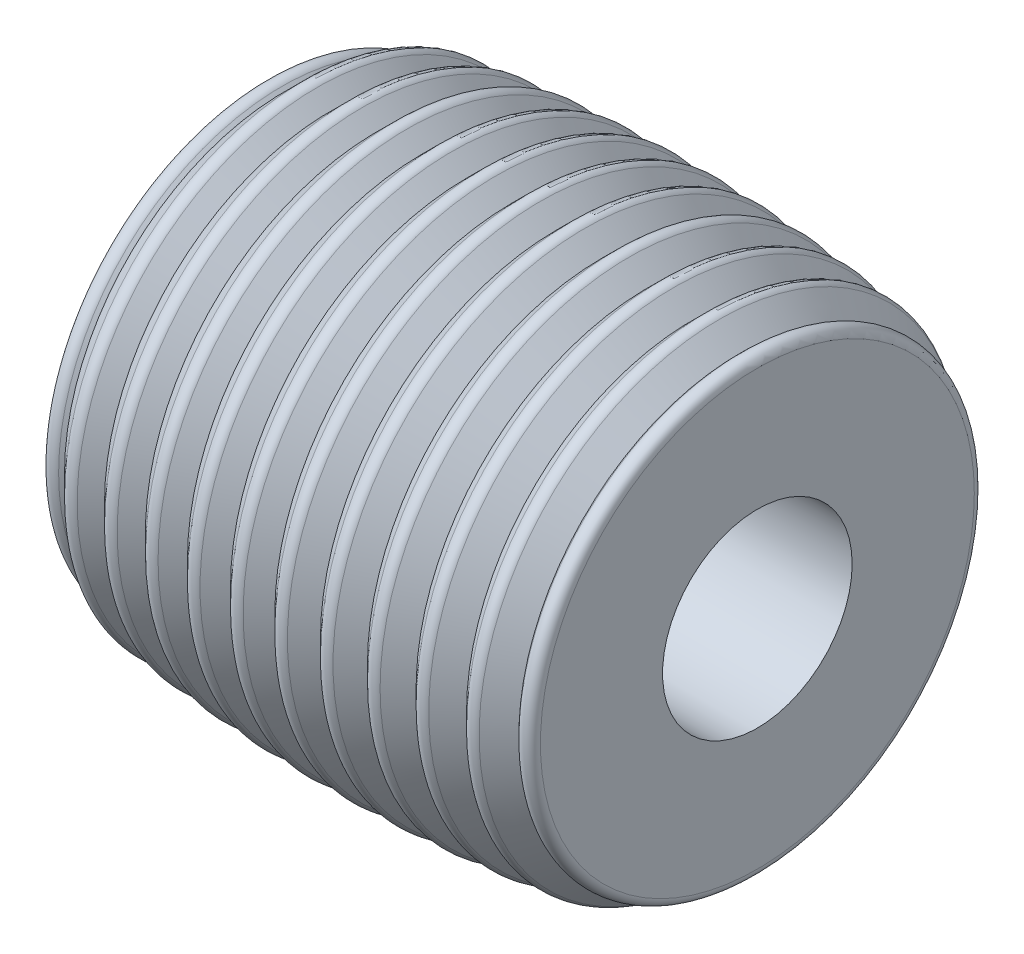
ISO-10303-21;
HEADER;
FILE_DESCRIPTION(('STEP AP214'),'2;1');
FILE_NAME('part.step','',(''),(''),'','','');
FILE_SCHEMA(('AUTOMOTIVE_DESIGN { 1 0 10303 214 1 1 1 1 }'));
ENDSEC;
DATA;
#1=APPLICATION_CONTEXT('core data for automotive mechanical design processes');
#2=APPLICATION_PROTOCOL_DEFINITION('international standard','automotive_design',2000,#1);
#3=PRODUCT_CONTEXT('',#1,'mechanical');
#4=PRODUCT('Part','Part','',(#3));
#5=PRODUCT_RELATED_PRODUCT_CATEGORY('part','',(#4));
#6=PRODUCT_DEFINITION_FORMATION('','',#4);
#7=PRODUCT_DEFINITION_CONTEXT('part definition',#1,'design');
#8=PRODUCT_DEFINITION('design','',#6,#7);
#9=PRODUCT_DEFINITION_SHAPE('','',#8);
#10=(LENGTH_UNIT() NAMED_UNIT(*) SI_UNIT(.MILLI.,.METRE.));
#11=(NAMED_UNIT(*) PLANE_ANGLE_UNIT() SI_UNIT($,.RADIAN.));
#12=(NAMED_UNIT(*) SI_UNIT($,.STERADIAN.) SOLID_ANGLE_UNIT());
#13=UNCERTAINTY_MEASURE_WITH_UNIT(LENGTH_MEASURE(1.E-05),#10,'distance_accuracy_value','');
#14=(GEOMETRIC_REPRESENTATION_CONTEXT(3) GLOBAL_UNCERTAINTY_ASSIGNED_CONTEXT((#13)) GLOBAL_UNIT_ASSIGNED_CONTEXT((#10,
#11,#12)) REPRESENTATION_CONTEXT('',''));
#15=CARTESIAN_POINT('',(0.,0.,0.));
#16=DIRECTION('',(0.,0.,1.));
#17=DIRECTION('',(1.,0.,0.));
#18=AXIS2_PLACEMENT_3D('',#15,#16,#17);
#19=CARTESIAN_POINT('',(-5.5,0.,0.));
#20=DIRECTION('',(1.,0.,0.));
#21=DIRECTION('',(0.,0.,-1.));
#22=AXIS2_PLACEMENT_3D('',#19,#20,#21);
#23=PLANE('',#22);
#24=CARTESIAN_POINT('',(-5.5,0.,0.));
#25=DIRECTION('',(1.,0.,0.));
#26=DIRECTION('',(0.,0.,-1.));
#27=AXIS2_PLACEMENT_3D('',#24,#25,#26);
#28=CIRCLE('',#27,4.86326545833715);
#29=CARTESIAN_POINT('',(-5.5,0.,-4.86326545833715));
#30=VERTEX_POINT('',#29);
#31=EDGE_CURVE('E10',#30,#30,#28,.F.);
#32=ORIENTED_EDGE('',*,*,#31,.T.);
#33=EDGE_LOOP('',(#32));
#34=FACE_BOUND('',#33,.T.);
#35=CARTESIAN_POINT('',(-5.5,0.,0.));
#36=DIRECTION('',(1.,0.,0.));
#37=DIRECTION('',(0.,0.,-1.));
#38=AXIS2_PLACEMENT_3D('',#35,#36,#37);
#39=CIRCLE('',#38,2.125);
#40=CARTESIAN_POINT('',(-5.5,0.,-2.125));
#41=VERTEX_POINT('',#40);
#42=EDGE_CURVE('E197',#41,#41,#39,.F.);
#43=ORIENTED_EDGE('',*,*,#42,.F.);
#44=EDGE_LOOP('',(#43));
#45=FACE_BOUND('',#44,.T.);
#46=ADVANCED_FACE('F47',(#34,#45),#23,.F.);
#47=CARTESIAN_POINT('',(5.09237884980486,0.,0.));
#48=DIRECTION('',(1.,0.,0.));
#49=DIRECTION('',(0.,0.,-1.));
#50=AXIS2_PLACEMENT_3D('',#47,#48,#49);
#51=CONICAL_SURFACE('',#50,4.93848702061656,0.785398163397463);
#52=CARTESIAN_POINT('',(5.15857864376269,0.,0.));
#53=DIRECTION('',(1.,0.,0.));
#54=DIRECTION('',(0.,0.,-1.));
#55=AXIS2_PLACEMENT_3D('',#52,#53,#54);
#56=CIRCLE('',#55,5.00468681457439);
#57=CARTESIAN_POINT('',(5.15857864376269,0.,-5.00468681457439));
#58=VERTEX_POINT('',#57);
#59=EDGE_CURVE('E124',#58,#58,#56,.F.);
#60=ORIENTED_EDGE('',*,*,#59,.T.);
#61=EDGE_LOOP('',(#60));
#62=FACE_BOUND('',#61,.T.);
#63=CARTESIAN_POINT('',(5.09237884980486,0.,0.));
#64=DIRECTION('',(1.,0.,0.));
#65=DIRECTION('',(0.,0.,-1.));
#66=AXIS2_PLACEMENT_3D('',#63,#64,#65);
#67=CIRCLE('',#66,4.93848702061656);
#68=CARTESIAN_POINT('',(5.09237884980486,0.,-4.93848702061656));
#69=VERTEX_POINT('',#68);
#70=EDGE_CURVE('E155',#69,#69,#67,.T.);
#71=ORIENTED_EDGE('',*,*,#70,.T.);
#72=EDGE_LOOP('',(#71));
#73=FACE_BOUND('',#72,.T.);
#74=ADVANCED_FACE('F225',(#62,#73),#51,.T.);
#75=CARTESIAN_POINT('',(4.50544744992651,0.,0.));
#76=DIRECTION('',(-1.,0.,0.));
#77=DIRECTION('',(0.,0.,1.));
#78=AXIS2_PLACEMENT_3D('',#75,#76,#77);
#79=CONICAL_SURFACE('',#78,5.5254184204949,0.785398163397437);
#80=CARTESIAN_POINT('',(4.64686880616382,0.,0.));
#81=DIRECTION('',(1.,0.,0.));
#82=DIRECTION('',(0.,0.,-1.));
#83=AXIS2_PLACEMENT_3D('',#80,#81,#82);
#84=CIRCLE('',#83,5.38399706425759);
#85=CARTESIAN_POINT('',(4.64686880616382,0.,-5.38399706425759));
#86=VERTEX_POINT('',#85);
#87=EDGE_CURVE('E136',#86,#86,#84,.T.);
#88=ORIENTED_EDGE('',*,*,#87,.T.);
#89=EDGE_LOOP('',(#88));
#90=FACE_BOUND('',#89,.T.);
#91=ORIENTED_EDGE('',*,*,#70,.F.);
#92=EDGE_LOOP('',(#91));
#93=FACE_BOUND('',#92,.T.);
#94=ADVANCED_FACE('F228',(#90,#93),#79,.T.);
#95=CARTESIAN_POINT('',(4.05735275363574,0.,0.));
#96=DIRECTION('',(1.,0.,0.));
#97=DIRECTION('',(0.,0.,-1.));
#98=AXIS2_PLACEMENT_3D('',#95,#96,#97);
#99=CONICAL_SURFACE('',#98,5.07732372420412,0.785398163397456);
#100=CARTESIAN_POINT('',(4.36402609368921,0.,0.));
#101=DIRECTION('',(-1.,0.,0.));
#102=DIRECTION('',(0.,0.,1.));
#103=AXIS2_PLACEMENT_3D('',#100,#101,#102);
#104=CIRCLE('',#103,5.38399706425759);
#105=CARTESIAN_POINT('',(4.36402609368921,0.,5.38399706425759));
#106=VERTEX_POINT('',#105);
#107=EDGE_CURVE('E132',#106,#106,#104,.T.);
#108=ORIENTED_EDGE('',*,*,#107,.T.);
#109=EDGE_LOOP('',(#108));
#110=FACE_BOUND('',#109,.T.);
#111=CARTESIAN_POINT('',(4.05735275363574,0.,0.));
#112=DIRECTION('',(1.,0.,0.));
#113=DIRECTION('',(0.,0.,-1.));
#114=AXIS2_PLACEMENT_3D('',#111,#112,#113);
#115=CIRCLE('',#114,5.07732372420412);
#116=CARTESIAN_POINT('',(4.05735275363574,0.,-5.07732372420412));
#117=VERTEX_POINT('',#116);
#118=EDGE_CURVE('E158',#117,#117,#115,.T.);
#119=ORIENTED_EDGE('',*,*,#118,.T.);
#120=EDGE_LOOP('',(#119));
#121=FACE_BOUND('',#120,.T.);
#122=ADVANCED_FACE('F235',(#110,#121),#99,.T.);
#123=CARTESIAN_POINT('',(3.49245488863042,0.,0.));
#124=DIRECTION('',(-1.,0.,0.));
#125=DIRECTION('',(0.,0.,1.));
#126=AXIS2_PLACEMENT_3D('',#123,#124,#125);
#127=CONICAL_SURFACE('',#126,5.64222158920941,0.785398163397426);
#128=CARTESIAN_POINT('',(3.63387624486774,0.,0.));
#129=DIRECTION('',(1.,0.,0.));
#130=DIRECTION('',(0.,0.,-1.));
#131=AXIS2_PLACEMENT_3D('',#128,#129,#130);
#132=CIRCLE('',#131,5.50080023297211);
#133=CARTESIAN_POINT('',(3.63387624486774,0.,-5.50080023297211));
#134=VERTEX_POINT('',#133);
#135=EDGE_CURVE('E151',#134,#134,#132,.T.);
#136=ORIENTED_EDGE('',*,*,#135,.T.);
#137=EDGE_LOOP('',(#136));
#138=FACE_BOUND('',#137,.T.);
#139=ORIENTED_EDGE('',*,*,#118,.F.);
#140=EDGE_LOOP('',(#139));
#141=FACE_BOUND('',#140,.T.);
#142=ADVANCED_FACE('F239',(#138,#141),#127,.T.);
#143=CARTESIAN_POINT('',(3.03360135933413,0.,0.));
#144=DIRECTION('',(1.,0.,0.));
#145=DIRECTION('',(0.,0.,-1.));
#146=AXIS2_PLACEMENT_3D('',#143,#144,#145);
#147=CONICAL_SURFACE('',#146,5.1833680599131,0.785398163397468);
#148=CARTESIAN_POINT('',(3.35103353239312,0.,0.));
#149=DIRECTION('',(-1.,0.,0.));
#150=DIRECTION('',(0.,0.,1.));
#151=AXIS2_PLACEMENT_3D('',#148,#149,#150);
#152=CIRCLE('',#151,5.5008002329721);
#153=CARTESIAN_POINT('',(3.35103353239312,0.,5.5008002329721));
#154=VERTEX_POINT('',#153);
#155=EDGE_CURVE('E147',#154,#154,#152,.T.);
#156=ORIENTED_EDGE('',*,*,#155,.T.);
#157=EDGE_LOOP('',(#156));
#158=FACE_BOUND('',#157,.T.);
#159=CARTESIAN_POINT('',(3.03360135933413,0.,0.));
#160=DIRECTION('',(1.,0.,0.));
#161=DIRECTION('',(0.,0.,-1.));
#162=AXIS2_PLACEMENT_3D('',#159,#160,#161);
#163=CIRCLE('',#162,5.1833680599131);
#164=CARTESIAN_POINT('',(3.03360135933413,0.,-5.1833680599131));
#165=VERTEX_POINT('',#164);
#166=EDGE_CURVE('E162',#165,#165,#163,.T.);
#167=ORIENTED_EDGE('',*,*,#166,.T.);
#168=EDGE_LOOP('',(#167));
#169=FACE_BOUND('',#168,.T.);
#170=ADVANCED_FACE('F243',(#158,#169),#147,.T.);
#171=CARTESIAN_POINT('',(2.48842748577145,0.,0.));
#172=DIRECTION('',(-1.,0.,0.));
#173=DIRECTION('',(0.,0.,1.));
#174=AXIS2_PLACEMENT_3D('',#171,#172,#173);
#175=CONICAL_SURFACE('',#174,5.72854193347576,0.78539816339743);
#176=CARTESIAN_POINT('',(2.62984884200876,0.,0.));
#177=DIRECTION('',(1.,0.,0.));
#178=DIRECTION('',(0.,0.,-1.));
#179=AXIS2_PLACEMENT_3D('',#176,#177,#178);
#180=CIRCLE('',#179,5.58712057723845);
#181=CARTESIAN_POINT('',(2.62984884200876,0.,-5.58712057723845));
#182=VERTEX_POINT('',#181);
#183=EDGE_CURVE('E144',#182,#182,#180,.T.);
#184=ORIENTED_EDGE('',*,*,#183,.T.);
#185=EDGE_LOOP('',(#184));
#186=FACE_BOUND('',#185,.T.);
#187=ORIENTED_EDGE('',*,*,#166,.F.);
#188=EDGE_LOOP('',(#187));
#189=FACE_BOUND('',#188,.T.);
#190=ADVANCED_FACE('F247',(#186,#189),#175,.T.);
#191=CARTESIAN_POINT('',(2.01800080876521,0.,0.));
#192=DIRECTION('',(1.,0.,0.));
#193=DIRECTION('',(0.,0.,-1.));
#194=AXIS2_PLACEMENT_3D('',#191,#192,#193);
#195=CONICAL_SURFACE('',#194,5.25811525646952,0.785398163397459);
#196=CARTESIAN_POINT('',(2.34700612953414,0.,0.));
#197=DIRECTION('',(-1.,0.,0.));
#198=DIRECTION('',(0.,0.,1.));
#199=AXIS2_PLACEMENT_3D('',#196,#197,#198);
#200=CIRCLE('',#199,5.58712057723845);
#201=CARTESIAN_POINT('',(2.34700612953414,0.,5.58712057723845));
#202=VERTEX_POINT('',#201);
#203=EDGE_CURVE('E140',#202,#202,#200,.T.);
#204=ORIENTED_EDGE('',*,*,#203,.T.);
#205=EDGE_LOOP('',(#204));
#206=FACE_BOUND('',#205,.T.);
#207=CARTESIAN_POINT('',(2.01800080876521,0.,0.));
#208=DIRECTION('',(1.,0.,0.));
#209=DIRECTION('',(0.,0.,-1.));
#210=AXIS2_PLACEMENT_3D('',#207,#208,#209);
#211=CIRCLE('',#210,5.25811525646952);
#212=CARTESIAN_POINT('',(2.01800080876521,0.,-5.25811525646952));
#213=VERTEX_POINT('',#212);
#214=EDGE_CURVE('E165',#213,#213,#211,.T.);
#215=ORIENTED_EDGE('',*,*,#214,.T.);
#216=EDGE_LOOP('',(#215));
#217=FACE_BOUND('',#216,.T.);
#218=ADVANCED_FACE('F251',(#206,#217),#195,.T.);
#219=CARTESIAN_POINT('',(1.49061870621543,0.,0.));
#220=DIRECTION('',(-1.,0.,0.));
#221=DIRECTION('',(0.,0.,1.));
#222=AXIS2_PLACEMENT_3D('',#219,#220,#221);
#223=CONICAL_SURFACE('',#222,5.78549735901928,0.785398163397432);
#224=CARTESIAN_POINT('',(1.63204006245274,0.,0.));
#225=DIRECTION('',(1.,0.,0.));
#226=DIRECTION('',(0.,0.,-1.));
#227=AXIS2_PLACEMENT_3D('',#224,#225,#226);
#228=CIRCLE('',#227,5.64407600278197);
#229=CARTESIAN_POINT('',(1.63204006245274,0.,-5.64407600278197));
#230=VERTEX_POINT('',#229);
#231=EDGE_CURVE('E120',#230,#230,#228,.T.);
#232=ORIENTED_EDGE('',*,*,#231,.T.);
#233=EDGE_LOOP('',(#232));
#234=FACE_BOUND('',#233,.T.);
#235=ORIENTED_EDGE('',*,*,#214,.F.);
#236=EDGE_LOOP('',(#235));
#237=FACE_BOUND('',#236,.T.);
#238=ADVANCED_FACE('F255',(#234,#237),#223,.T.);
#239=CARTESIAN_POINT('',(1.0076963467989,0.,0.));
#240=DIRECTION('',(1.,0.,0.));
#241=DIRECTION('',(0.,0.,-1.));
#242=AXIS2_PLACEMENT_3D('',#239,#240,#241);
#243=CONICAL_SURFACE('',#242,5.30257499960273,0.785398163397463);
#244=CARTESIAN_POINT('',(1.34919734997813,0.,0.));
#245=DIRECTION('',(-1.,0.,0.));
#246=DIRECTION('',(0.,0.,1.));
#247=AXIS2_PLACEMENT_3D('',#244,#245,#246);
#248=CIRCLE('',#247,5.64407600278196);
#249=CARTESIAN_POINT('',(1.34919734997813,0.,5.64407600278196));
#250=VERTEX_POINT('',#249);
#251=EDGE_CURVE('E116',#250,#250,#248,.T.);
#252=ORIENTED_EDGE('',*,*,#251,.T.);
#253=EDGE_LOOP('',(#252));
#254=FACE_BOUND('',#253,.T.);
#255=CARTESIAN_POINT('',(1.0076963467989,0.,0.));
#256=DIRECTION('',(1.,0.,0.));
#257=DIRECTION('',(0.,0.,-1.));
#258=AXIS2_PLACEMENT_3D('',#255,#256,#257);
#259=CIRCLE('',#258,5.30257499960273);
#260=CARTESIAN_POINT('',(1.0076963467989,0.,-5.30257499960273));
#261=VERTEX_POINT('',#260);
#262=EDGE_CURVE('E169',#261,#261,#259,.T.);
#263=ORIENTED_EDGE('',*,*,#262,.T.);
#264=EDGE_LOOP('',(#263));
#265=FACE_BOUND('',#264,.T.);
#266=ADVANCED_FACE('F259',(#254,#265),#243,.T.);
#267=CARTESIAN_POINT('',(0.496470070297796,0.,0.));
#268=DIRECTION('',(-1.,0.,0.));
#269=DIRECTION('',(0.,0.,1.));
#270=AXIS2_PLACEMENT_3D('',#267,#268,#269);
#271=CONICAL_SURFACE('',#270,5.81380127610383,0.78539816339744);
#272=CARTESIAN_POINT('',(0.637891426535106,0.,0.));
#273=DIRECTION('',(1.,0.,0.));
#274=DIRECTION('',(0.,0.,-1.));
#275=AXIS2_PLACEMENT_3D('',#272,#273,#274);
#276=CIRCLE('',#275,5.67237991986653);
#277=CARTESIAN_POINT('',(0.637891426535106,0.,-5.67237991986653));
#278=VERTEX_POINT('',#277);
#279=EDGE_CURVE('E112',#278,#278,#276,.T.);
#280=ORIENTED_EDGE('',*,*,#279,.T.);
#281=EDGE_LOOP('',(#280));
#282=FACE_BOUND('',#281,.T.);
#283=ORIENTED_EDGE('',*,*,#262,.F.);
#284=EDGE_LOOP('',(#283));
#285=FACE_BOUND('',#284,.T.);
#286=ADVANCED_FACE('F263',(#282,#285),#271,.T.);
#287=CARTESIAN_POINT('',(0.,0.,0.));
#288=DIRECTION('',(1.,0.,0.));
#289=DIRECTION('',(0.,0.,-1.));
#290=AXIS2_PLACEMENT_3D('',#287,#288,#289);
#291=CONICAL_SURFACE('',#290,5.31733120580604,0.785398163397447);
#292=CARTESIAN_POINT('',(0.355048714060489,0.,0.));
#293=DIRECTION('',(-1.,0.,0.));
#294=DIRECTION('',(0.,0.,1.));
#295=AXIS2_PLACEMENT_3D('',#292,#293,#294);
#296=CIRCLE('',#295,5.67237991986653);
#297=CARTESIAN_POINT('',(0.355048714060489,0.,5.67237991986653));
#298=VERTEX_POINT('',#297);
#299=EDGE_CURVE('E108',#298,#298,#296,.T.);
#300=ORIENTED_EDGE('',*,*,#299,.T.);
#301=EDGE_LOOP('',(#300));
#302=FACE_BOUND('',#301,.T.);
#303=CARTESIAN_POINT('',(0.,0.,0.));
#304=DIRECTION('',(1.,0.,0.));
#305=DIRECTION('',(0.,0.,-1.));
#306=AXIS2_PLACEMENT_3D('',#303,#304,#305);
#307=CIRCLE('',#306,5.31733120580604);
#308=CARTESIAN_POINT('',(0.,0.,-5.31733120580604));
#309=VERTEX_POINT('',#308);
#310=EDGE_CURVE('E173',#309,#309,#307,.T.);
#311=ORIENTED_EDGE('',*,*,#310,.T.);
#312=EDGE_LOOP('',(#311));
#313=FACE_BOUND('',#312,.T.);
#314=ADVANCED_FACE('F267',(#302,#313),#291,.T.);
#315=CARTESIAN_POINT('',(0.,0.,0.));
#316=DIRECTION('',(-1.,0.,0.));
#317=DIRECTION('',(0.,0.,1.));
#318=AXIS2_PLACEMENT_3D('',#315,#316,#317);
#319=CONICAL_SURFACE('',#318,5.31733120580604,0.78539816339744);
#320=CARTESIAN_POINT('',(-0.355048714060494,0.,0.));
#321=DIRECTION('',(1.,0.,0.));
#322=DIRECTION('',(0.,0.,-1.));
#323=AXIS2_PLACEMENT_3D('',#320,#321,#322);
#324=CIRCLE('',#323,5.67237991986653);
#325=CARTESIAN_POINT('',(-0.355048714060494,0.,-5.67237991986653));
#326=VERTEX_POINT('',#325);
#327=EDGE_CURVE('E104',#326,#326,#324,.T.);
#328=ORIENTED_EDGE('',*,*,#327,.T.);
#329=EDGE_LOOP('',(#328));
#330=FACE_BOUND('',#329,.T.);
#331=ORIENTED_EDGE('',*,*,#310,.F.);
#332=EDGE_LOOP('',(#331));
#333=FACE_BOUND('',#332,.T.);
#334=ADVANCED_FACE('F271',(#330,#333),#319,.T.);
#335=CARTESIAN_POINT('',(-0.496470070297805,0.,0.));
#336=DIRECTION('',(1.,0.,0.));
#337=DIRECTION('',(0.,0.,-1.));
#338=AXIS2_PLACEMENT_3D('',#335,#336,#337);
#339=CONICAL_SURFACE('',#338,5.81380127610384,0.785398163397458);
#340=CARTESIAN_POINT('',(-0.637891426535113,0.,0.));
#341=DIRECTION('',(-1.,0.,0.));
#342=DIRECTION('',(0.,0.,1.));
#343=AXIS2_PLACEMENT_3D('',#340,#341,#342);
#344=CIRCLE('',#343,5.67237991986652);
#345=CARTESIAN_POINT('',(-0.637891426535113,0.,5.67237991986652));
#346=VERTEX_POINT('',#345);
#347=EDGE_CURVE('E100',#346,#346,#344,.T.);
#348=ORIENTED_EDGE('',*,*,#347,.T.);
#349=EDGE_LOOP('',(#348));
#350=FACE_BOUND('',#349,.T.);
#351=CARTESIAN_POINT('',(-1.00769634679889,0.,0.));
#352=DIRECTION('',(1.,0.,0.));
#353=DIRECTION('',(0.,0.,-1.));
#354=AXIS2_PLACEMENT_3D('',#351,#352,#353);
#355=CIRCLE('',#354,5.30257499960274);
#356=CARTESIAN_POINT('',(-1.00769634679889,0.,-5.30257499960274));
#357=VERTEX_POINT('',#356);
#358=EDGE_CURVE('E177',#357,#357,#355,.T.);
#359=ORIENTED_EDGE('',*,*,#358,.T.);
#360=EDGE_LOOP('',(#359));
#361=FACE_BOUND('',#360,.T.);
#362=ADVANCED_FACE('F275',(#350,#361),#339,.T.);
#363=CARTESIAN_POINT('',(-1.00769634679889,0.,0.));
#364=DIRECTION('',(-1.,0.,0.));
#365=DIRECTION('',(0.,0.,1.));
#366=AXIS2_PLACEMENT_3D('',#363,#364,#365);
#367=CONICAL_SURFACE('',#366,5.30257499960274,0.785398163397445);
#368=CARTESIAN_POINT('',(-1.34919734997812,0.,0.));
#369=DIRECTION('',(1.,0.,0.));
#370=DIRECTION('',(0.,0.,-1.));
#371=AXIS2_PLACEMENT_3D('',#368,#369,#370);
#372=CIRCLE('',#371,5.64407600278196);
#373=CARTESIAN_POINT('',(-1.34919734997812,0.,-5.64407600278196));
#374=VERTEX_POINT('',#373);
#375=EDGE_CURVE('E96',#374,#374,#372,.T.);
#376=ORIENTED_EDGE('',*,*,#375,.T.);
#377=EDGE_LOOP('',(#376));
#378=FACE_BOUND('',#377,.T.);
#379=ORIENTED_EDGE('',*,*,#358,.F.);
#380=EDGE_LOOP('',(#379));
#381=FACE_BOUND('',#380,.T.);
#382=ADVANCED_FACE('F279',(#378,#381),#367,.T.);
#383=CARTESIAN_POINT('',(-1.49061870621543,0.,0.));
#384=DIRECTION('',(1.,0.,0.));
#385=DIRECTION('',(0.,0.,-1.));
#386=AXIS2_PLACEMENT_3D('',#383,#384,#385);
#387=CONICAL_SURFACE('',#386,5.78549735901927,0.785398163397461);
#388=CARTESIAN_POINT('',(-1.63204006245274,0.,0.));
#389=DIRECTION('',(-1.,0.,0.));
#390=DIRECTION('',(0.,0.,1.));
#391=AXIS2_PLACEMENT_3D('',#388,#389,#390);
#392=CIRCLE('',#391,5.64407600278196);
#393=CARTESIAN_POINT('',(-1.63204006245274,0.,5.64407600278196));
#394=VERTEX_POINT('',#393);
#395=EDGE_CURVE('E92',#394,#394,#392,.T.);
#396=ORIENTED_EDGE('',*,*,#395,.T.);
#397=EDGE_LOOP('',(#396));
#398=FACE_BOUND('',#397,.T.);
#399=CARTESIAN_POINT('',(-2.01800080876517,0.,0.));
#400=DIRECTION('',(1.,0.,0.));
#401=DIRECTION('',(0.,0.,-1.));
#402=AXIS2_PLACEMENT_3D('',#399,#400,#401);
#403=CIRCLE('',#402,5.25811525646952);
#404=CARTESIAN_POINT('',(-2.01800080876517,0.,-5.25811525646952));
#405=VERTEX_POINT('',#404);
#406=EDGE_CURVE('E181',#405,#405,#403,.T.);
#407=ORIENTED_EDGE('',*,*,#406,.T.);
#408=EDGE_LOOP('',(#407));
#409=FACE_BOUND('',#408,.T.);
#410=ADVANCED_FACE('F283',(#398,#409),#387,.T.);
#411=CARTESIAN_POINT('',(-2.01800080876517,0.,0.));
#412=DIRECTION('',(-1.,0.,0.));
#413=DIRECTION('',(0.,0.,1.));
#414=AXIS2_PLACEMENT_3D('',#411,#412,#413);
#415=CONICAL_SURFACE('',#414,5.25811525646952,0.785398163397439);
#416=CARTESIAN_POINT('',(-2.34700612953412,0.,0.));
#417=DIRECTION('',(1.,0.,0.));
#418=DIRECTION('',(0.,0.,-1.));
#419=AXIS2_PLACEMENT_3D('',#416,#417,#418);
#420=CIRCLE('',#419,5.58712057723846);
#421=CARTESIAN_POINT('',(-2.34700612953412,0.,-5.58712057723846));
#422=VERTEX_POINT('',#421);
#423=EDGE_CURVE('E88',#422,#422,#420,.T.);
#424=ORIENTED_EDGE('',*,*,#423,.T.);
#425=EDGE_LOOP('',(#424));
#426=FACE_BOUND('',#425,.T.);
#427=ORIENTED_EDGE('',*,*,#406,.F.);
#428=EDGE_LOOP('',(#427));
#429=FACE_BOUND('',#428,.T.);
#430=ADVANCED_FACE('F287',(#426,#429),#415,.T.);
#431=CARTESIAN_POINT('',(-2.48842748577143,0.,0.));
#432=DIRECTION('',(1.,0.,0.));
#433=DIRECTION('',(0.,0.,-1.));
#434=AXIS2_PLACEMENT_3D('',#431,#432,#433);
#435=CONICAL_SURFACE('',#434,5.72854193347577,0.785398163397449);
#436=CARTESIAN_POINT('',(-2.62984884200874,0.,0.));
#437=DIRECTION('',(-1.,0.,0.));
#438=DIRECTION('',(0.,0.,1.));
#439=AXIS2_PLACEMENT_3D('',#436,#437,#438);
#440=CIRCLE('',#439,5.58712057723846);
#441=CARTESIAN_POINT('',(-2.62984884200874,0.,5.58712057723846));
#442=VERTEX_POINT('',#441);
#443=EDGE_CURVE('E84',#442,#442,#440,.T.);
#444=ORIENTED_EDGE('',*,*,#443,.T.);
#445=EDGE_LOOP('',(#444));
#446=FACE_BOUND('',#445,.T.);
#447=CARTESIAN_POINT('',(-3.03360135933409,0.,0.));
#448=DIRECTION('',(1.,0.,0.));
#449=DIRECTION('',(0.,0.,-1.));
#450=AXIS2_PLACEMENT_3D('',#447,#448,#449);
#451=CIRCLE('',#450,5.1833680599131);
#452=CARTESIAN_POINT('',(-3.03360135933409,0.,-5.1833680599131));
#453=VERTEX_POINT('',#452);
#454=EDGE_CURVE('E185',#453,#453,#451,.T.);
#455=ORIENTED_EDGE('',*,*,#454,.T.);
#456=EDGE_LOOP('',(#455));
#457=FACE_BOUND('',#456,.T.);
#458=ADVANCED_FACE('F291',(#446,#457),#435,.T.);
#459=CARTESIAN_POINT('',(-3.03360135933409,0.,0.));
#460=DIRECTION('',(-1.,0.,0.));
#461=DIRECTION('',(0.,0.,1.));
#462=AXIS2_PLACEMENT_3D('',#459,#460,#461);
#463=CONICAL_SURFACE('',#462,5.1833680599131,0.785398163397444);
#464=CARTESIAN_POINT('',(-3.3510335323931,0.,0.));
#465=DIRECTION('',(1.,0.,0.));
#466=DIRECTION('',(0.,0.,-1.));
#467=AXIS2_PLACEMENT_3D('',#464,#465,#466);
#468=CIRCLE('',#467,5.5008002329721);
#469=CARTESIAN_POINT('',(-3.3510335323931,0.,-5.5008002329721));
#470=VERTEX_POINT('',#469);
#471=EDGE_CURVE('E80',#470,#470,#468,.T.);
#472=ORIENTED_EDGE('',*,*,#471,.T.);
#473=EDGE_LOOP('',(#472));
#474=FACE_BOUND('',#473,.T.);
#475=ORIENTED_EDGE('',*,*,#454,.F.);
#476=EDGE_LOOP('',(#475));
#477=FACE_BOUND('',#476,.T.);
#478=ADVANCED_FACE('F295',(#474,#477),#463,.T.);
#479=CARTESIAN_POINT('',(-3.49245488863041,0.,0.));
#480=DIRECTION('',(1.,0.,0.));
#481=DIRECTION('',(0.,0.,-1.));
#482=AXIS2_PLACEMENT_3D('',#479,#480,#481);
#483=CONICAL_SURFACE('',#482,5.64222158920941,0.785398163397451);
#484=CARTESIAN_POINT('',(-3.63387624486772,0.,0.));
#485=DIRECTION('',(-1.,0.,0.));
#486=DIRECTION('',(0.,0.,1.));
#487=AXIS2_PLACEMENT_3D('',#484,#485,#486);
#488=CIRCLE('',#487,5.5008002329721);
#489=CARTESIAN_POINT('',(-3.63387624486772,0.,5.5008002329721));
#490=VERTEX_POINT('',#489);
#491=EDGE_CURVE('E77',#490,#490,#488,.T.);
#492=ORIENTED_EDGE('',*,*,#491,.T.);
#493=EDGE_LOOP('',(#492));
#494=FACE_BOUND('',#493,.T.);
#495=CARTESIAN_POINT('',(-4.05735275363569,0.,0.));
#496=DIRECTION('',(1.,0.,0.));
#497=DIRECTION('',(0.,0.,-1.));
#498=AXIS2_PLACEMENT_3D('',#495,#496,#497);
#499=CIRCLE('',#498,5.07732372420412);
#500=CARTESIAN_POINT('',(-4.05735275363569,0.,-5.07732372420412));
#501=VERTEX_POINT('',#500);
#502=EDGE_CURVE('E189',#501,#501,#499,.T.);
#503=ORIENTED_EDGE('',*,*,#502,.T.);
#504=EDGE_LOOP('',(#503));
#505=FACE_BOUND('',#504,.T.);
#506=ADVANCED_FACE('F299',(#494,#505),#483,.T.);
#507=CARTESIAN_POINT('',(-4.05735275363569,0.,0.));
#508=DIRECTION('',(-1.,0.,0.));
#509=DIRECTION('',(0.,0.,1.));
#510=AXIS2_PLACEMENT_3D('',#507,#508,#509);
#511=CONICAL_SURFACE('',#510,5.07732372420412,0.785398163397441);
#512=CARTESIAN_POINT('',(-4.36402609368917,0.,0.));
#513=DIRECTION('',(1.,0.,0.));
#514=DIRECTION('',(0.,0.,-1.));
#515=AXIS2_PLACEMENT_3D('',#512,#513,#514);
#516=CIRCLE('',#515,5.3839970642576);
#517=CARTESIAN_POINT('',(-4.36402609368917,0.,-5.3839970642576));
#518=VERTEX_POINT('',#517);
#519=EDGE_CURVE('E71',#518,#518,#516,.T.);
#520=ORIENTED_EDGE('',*,*,#519,.T.);
#521=EDGE_LOOP('',(#520));
#522=FACE_BOUND('',#521,.T.);
#523=ORIENTED_EDGE('',*,*,#502,.F.);
#524=EDGE_LOOP('',(#523));
#525=FACE_BOUND('',#524,.T.);
#526=ADVANCED_FACE('F303',(#522,#525),#511,.T.);
#527=CARTESIAN_POINT('',(-4.50544744992648,0.,0.));
#528=DIRECTION('',(1.,0.,0.));
#529=DIRECTION('',(0.,0.,-1.));
#530=AXIS2_PLACEMENT_3D('',#527,#528,#529);
#531=CONICAL_SURFACE('',#530,5.5254184204949,0.785398163397463);
#532=CARTESIAN_POINT('',(-4.64686880616379,0.,0.));
#533=DIRECTION('',(-1.,0.,0.));
#534=DIRECTION('',(0.,0.,1.));
#535=AXIS2_PLACEMENT_3D('',#532,#533,#534);
#536=CIRCLE('',#535,5.38399706425759);
#537=CARTESIAN_POINT('',(-4.64686880616379,0.,5.38399706425759));
#538=VERTEX_POINT('',#537);
#539=EDGE_CURVE('E63',#538,#538,#536,.T.);
#540=ORIENTED_EDGE('',*,*,#539,.T.);
#541=EDGE_LOOP('',(#540));
#542=FACE_BOUND('',#541,.T.);
#543=CARTESIAN_POINT('',(-5.0923788498048,0.,0.));
#544=DIRECTION('',(1.,0.,0.));
#545=DIRECTION('',(0.,0.,-1.));
#546=AXIS2_PLACEMENT_3D('',#543,#544,#545);
#547=CIRCLE('',#546,4.93848702061657);
#548=CARTESIAN_POINT('',(-5.0923788498048,0.,-4.93848702061657));
#549=VERTEX_POINT('',#548);
#550=EDGE_CURVE('E193',#549,#549,#547,.T.);
#551=ORIENTED_EDGE('',*,*,#550,.T.);
#552=EDGE_LOOP('',(#551));
#553=FACE_BOUND('',#552,.T.);
#554=ADVANCED_FACE('F220',(#542,#553),#531,.T.);
#555=CARTESIAN_POINT('',(-5.0923788498048,0.,0.));
#556=DIRECTION('',(-1.,0.,0.));
#557=DIRECTION('',(0.,0.,1.));
#558=AXIS2_PLACEMENT_3D('',#555,#556,#557);
#559=CONICAL_SURFACE('',#558,4.93848702061657,0.785398163397433);
#560=CARTESIAN_POINT('',(-5.15857864376269,0.,0.));
#561=DIRECTION('',(-1.,0.,0.));
#562=DIRECTION('',(0.,0.,1.));
#563=AXIS2_PLACEMENT_3D('',#560,#561,#562);
#564=CIRCLE('',#563,5.00468681457446);
#565=CARTESIAN_POINT('',(-5.15857864376269,0.,5.00468681457446));
#566=VERTEX_POINT('',#565);
#567=EDGE_CURVE('E55',#566,#566,#564,.F.);
#568=ORIENTED_EDGE('',*,*,#567,.T.);
#569=EDGE_LOOP('',(#568));
#570=FACE_BOUND('',#569,.T.);
#571=ORIENTED_EDGE('',*,*,#550,.F.);
#572=EDGE_LOOP('',(#571));
#573=FACE_BOUND('',#572,.T.);
#574=ADVANCED_FACE('F212',(#570,#573),#559,.T.);
#575=CARTESIAN_POINT('',(5.5,0.,0.));
#576=DIRECTION('',(1.,0.,0.));
#577=DIRECTION('',(0.,0.,-1.));
#578=AXIS2_PLACEMENT_3D('',#575,#576,#577);
#579=PLANE('',#578);
#580=CARTESIAN_POINT('',(5.5,0.,0.));
#581=DIRECTION('',(1.,0.,0.));
#582=DIRECTION('',(0.,0.,-1.));
#583=AXIS2_PLACEMENT_3D('',#580,#581,#582);
#584=CIRCLE('',#583,4.86326545833708);
#585=CARTESIAN_POINT('',(5.5,0.,-4.86326545833708));
#586=VERTEX_POINT('',#585);
#587=EDGE_CURVE('E128',#586,#586,#584,.T.);
#588=ORIENTED_EDGE('',*,*,#587,.T.);
#589=EDGE_LOOP('',(#588));
#590=FACE_BOUND('',#589,.T.);
#591=CARTESIAN_POINT('',(5.5,0.,0.));
#592=DIRECTION('',(1.,0.,0.));
#593=DIRECTION('',(0.,0.,-1.));
#594=AXIS2_PLACEMENT_3D('',#591,#592,#593);
#595=CIRCLE('',#594,2.125);
#596=CARTESIAN_POINT('',(5.5,0.,-2.125));
#597=VERTEX_POINT('',#596);
#598=EDGE_CURVE('E201',#597,#597,#595,.T.);
#599=ORIENTED_EDGE('',*,*,#598,.F.);
#600=EDGE_LOOP('',(#599));
#601=FACE_BOUND('',#600,.T.);
#602=ADVANCED_FACE('F210',(#590,#601),#579,.T.);
#603=CARTESIAN_POINT('',(-5.501,0.,0.));
#604=DIRECTION('',(1.,0.,0.));
#605=DIRECTION('',(0.,0.,-1.));
#606=AXIS2_PLACEMENT_3D('',#603,#604,#605);
#607=CYLINDRICAL_SURFACE('',#606,2.125);
#608=ORIENTED_EDGE('',*,*,#598,.T.);
#609=EDGE_LOOP('',(#608));
#610=FACE_BOUND('',#609,.T.);
#611=ORIENTED_EDGE('',*,*,#42,.T.);
#612=EDGE_LOOP('',(#611));
#613=FACE_BOUND('',#612,.T.);
#614=ADVANCED_FACE('F207',(#610,#613),#607,.F.);
#615=CARTESIAN_POINT('',(3.49245488863043,0.,0.));
#616=DIRECTION('',(-1.,0.,0.));
#617=DIRECTION('',(0.,0.,1.));
#618=AXIS2_PLACEMENT_3D('',#615,#616,#617);
#619=TOROIDAL_SURFACE('',#618,5.3593788767348,0.2);
#620=ORIENTED_EDGE('',*,*,#155,.F.);
#621=EDGE_LOOP('',(#620));
#622=FACE_BOUND('',#621,.T.);
#623=ORIENTED_EDGE('',*,*,#135,.F.);
#624=EDGE_LOOP('',(#623));
#625=FACE_BOUND('',#624,.T.);
#626=ADVANCED_FACE('F218',(#622,#625),#619,.T.);
#627=CARTESIAN_POINT('',(2.48842748577145,0.,0.));
#628=DIRECTION('',(-1.,0.,0.));
#629=DIRECTION('',(0.,0.,1.));
#630=AXIS2_PLACEMENT_3D('',#627,#628,#629);
#631=TOROIDAL_SURFACE('',#630,5.44569922100114,0.2);
#632=ORIENTED_EDGE('',*,*,#203,.F.);
#633=EDGE_LOOP('',(#632));
#634=FACE_BOUND('',#633,.T.);
#635=ORIENTED_EDGE('',*,*,#183,.F.);
#636=EDGE_LOOP('',(#635));
#637=FACE_BOUND('',#636,.T.);
#638=ADVANCED_FACE('F358',(#634,#637),#631,.T.);
#639=CARTESIAN_POINT('',(4.50544744992652,0.,0.));
#640=DIRECTION('',(-1.,0.,0.));
#641=DIRECTION('',(0.,0.,1.));
#642=AXIS2_PLACEMENT_3D('',#639,#640,#641);
#643=TOROIDAL_SURFACE('',#642,5.24257570802028,0.2);
#644=ORIENTED_EDGE('',*,*,#107,.F.);
#645=EDGE_LOOP('',(#644));
#646=FACE_BOUND('',#645,.T.);
#647=ORIENTED_EDGE('',*,*,#87,.F.);
#648=EDGE_LOOP('',(#647));
#649=FACE_BOUND('',#648,.T.);
#650=ADVANCED_FACE('F354',(#646,#649),#643,.T.);
#651=CARTESIAN_POINT('',(5.3,0.,0.));
#652=DIRECTION('',(1.,0.,0.));
#653=DIRECTION('',(0.,0.,-1.));
#654=AXIS2_PLACEMENT_3D('',#651,#652,#653);
#655=TOROIDAL_SURFACE('',#654,4.86326545833708,0.2);
#656=ORIENTED_EDGE('',*,*,#59,.F.);
#657=EDGE_LOOP('',(#656));
#658=FACE_BOUND('',#657,.T.);
#659=ORIENTED_EDGE('',*,*,#587,.F.);
#660=EDGE_LOOP('',(#659));
#661=FACE_BOUND('',#660,.T.);
#662=ADVANCED_FACE('F350',(#658,#661),#655,.T.);
#663=CARTESIAN_POINT('',(1.49061870621544,0.,0.));
#664=DIRECTION('',(-1.,0.,0.));
#665=DIRECTION('',(0.,0.,1.));
#666=AXIS2_PLACEMENT_3D('',#663,#664,#665);
#667=TOROIDAL_SURFACE('',#666,5.50265464654466,0.2);
#668=ORIENTED_EDGE('',*,*,#251,.F.);
#669=EDGE_LOOP('',(#668));
#670=FACE_BOUND('',#669,.T.);
#671=ORIENTED_EDGE('',*,*,#231,.F.);
#672=EDGE_LOOP('',(#671));
#673=FACE_BOUND('',#672,.T.);
#674=ADVANCED_FACE('F346',(#670,#673),#667,.T.);
#675=CARTESIAN_POINT('',(0.496470070297797,0.,0.));
#676=DIRECTION('',(-1.,0.,0.));
#677=DIRECTION('',(0.,0.,1.));
#678=AXIS2_PLACEMENT_3D('',#675,#676,#677);
#679=TOROIDAL_SURFACE('',#678,5.53095856362922,0.2);
#680=ORIENTED_EDGE('',*,*,#299,.F.);
#681=EDGE_LOOP('',(#680));
#682=FACE_BOUND('',#681,.T.);
#683=ORIENTED_EDGE('',*,*,#279,.F.);
#684=EDGE_LOOP('',(#683));
#685=FACE_BOUND('',#684,.T.);
#686=ADVANCED_FACE('F342',(#682,#685),#679,.T.);
#687=CARTESIAN_POINT('',(-0.496470070297802,0.,0.));
#688=DIRECTION('',(-1.,0.,0.));
#689=DIRECTION('',(0.,0.,1.));
#690=AXIS2_PLACEMENT_3D('',#687,#688,#689);
#691=TOROIDAL_SURFACE('',#690,5.53095856362922,0.2);
#692=ORIENTED_EDGE('',*,*,#347,.F.);
#693=EDGE_LOOP('',(#692));
#694=FACE_BOUND('',#693,.T.);
#695=ORIENTED_EDGE('',*,*,#327,.F.);
#696=EDGE_LOOP('',(#695));
#697=FACE_BOUND('',#696,.T.);
#698=ADVANCED_FACE('F338',(#694,#697),#691,.T.);
#699=CARTESIAN_POINT('',(-1.49061870621542,0.,0.));
#700=DIRECTION('',(-1.,0.,0.));
#701=DIRECTION('',(0.,0.,1.));
#702=AXIS2_PLACEMENT_3D('',#699,#700,#701);
#703=TOROIDAL_SURFACE('',#702,5.50265464654465,0.2);
#704=ORIENTED_EDGE('',*,*,#395,.F.);
#705=EDGE_LOOP('',(#704));
#706=FACE_BOUND('',#705,.T.);
#707=ORIENTED_EDGE('',*,*,#375,.F.);
#708=EDGE_LOOP('',(#707));
#709=FACE_BOUND('',#708,.T.);
#710=ADVANCED_FACE('F334',(#706,#709),#703,.T.);
#711=CARTESIAN_POINT('',(-2.48842748577143,0.,0.));
#712=DIRECTION('',(-1.,0.,0.));
#713=DIRECTION('',(0.,0.,1.));
#714=AXIS2_PLACEMENT_3D('',#711,#712,#713);
#715=TOROIDAL_SURFACE('',#714,5.44569922100115,0.2);
#716=ORIENTED_EDGE('',*,*,#443,.F.);
#717=EDGE_LOOP('',(#716));
#718=FACE_BOUND('',#717,.T.);
#719=ORIENTED_EDGE('',*,*,#423,.F.);
#720=EDGE_LOOP('',(#719));
#721=FACE_BOUND('',#720,.T.);
#722=ADVANCED_FACE('F328',(#718,#721),#715,.T.);
#723=CARTESIAN_POINT('',(-3.49245488863041,0.,0.));
#724=DIRECTION('',(-1.,0.,0.));
#725=DIRECTION('',(0.,0.,1.));
#726=AXIS2_PLACEMENT_3D('',#723,#724,#725);
#727=TOROIDAL_SURFACE('',#726,5.35937887673479,0.2);
#728=ORIENTED_EDGE('',*,*,#491,.F.);
#729=EDGE_LOOP('',(#728));
#730=FACE_BOUND('',#729,.T.);
#731=ORIENTED_EDGE('',*,*,#471,.F.);
#732=EDGE_LOOP('',(#731));
#733=FACE_BOUND('',#732,.T.);
#734=ADVANCED_FACE('F319',(#730,#733),#727,.T.);
#735=CARTESIAN_POINT('',(-4.50544744992648,0.,0.));
#736=DIRECTION('',(-1.,0.,0.));
#737=DIRECTION('',(0.,0.,1.));
#738=AXIS2_PLACEMENT_3D('',#735,#736,#737);
#739=TOROIDAL_SURFACE('',#738,5.24257570802028,0.2);
#740=ORIENTED_EDGE('',*,*,#539,.F.);
#741=EDGE_LOOP('',(#740));
#742=FACE_BOUND('',#741,.T.);
#743=ORIENTED_EDGE('',*,*,#519,.F.);
#744=EDGE_LOOP('',(#743));
#745=FACE_BOUND('',#744,.T.);
#746=ADVANCED_FACE('F316',(#742,#745),#739,.T.);
#747=CARTESIAN_POINT('',(-5.3,0.,0.));
#748=DIRECTION('',(1.,0.,0.));
#749=DIRECTION('',(0.,0.,-1.));
#750=AXIS2_PLACEMENT_3D('',#747,#748,#749);
#751=TOROIDAL_SURFACE('',#750,4.86326545833715,0.2);
#752=ORIENTED_EDGE('',*,*,#31,.F.);
#753=EDGE_LOOP('',(#752));
#754=FACE_BOUND('',#753,.T.);
#755=ORIENTED_EDGE('',*,*,#567,.F.);
#756=EDGE_LOOP('',(#755));
#757=FACE_BOUND('',#756,.T.);
#758=ADVANCED_FACE('F49',(#754,#757),#751,.T.);
#759=CLOSED_SHELL('',(#46,#74,#94,#122,#142,#170,#190,#218,#238,#266,#286,#314,#334,#362,#382,
#410,#430,#458,#478,#506,#526,#554,#574,#602,#614,#626,#638,#650,#662,#674,#686,#698,#710,#722,
#734,#746,#758));
#760=MANIFOLD_SOLID_BREP('B2',#759);
#761=ADVANCED_BREP_SHAPE_REPRESENTATION('',(#18,#760),#14);
#762=SHAPE_DEFINITION_REPRESENTATION(#9,#761);
ENDSEC;
END-ISO-10303-21;
